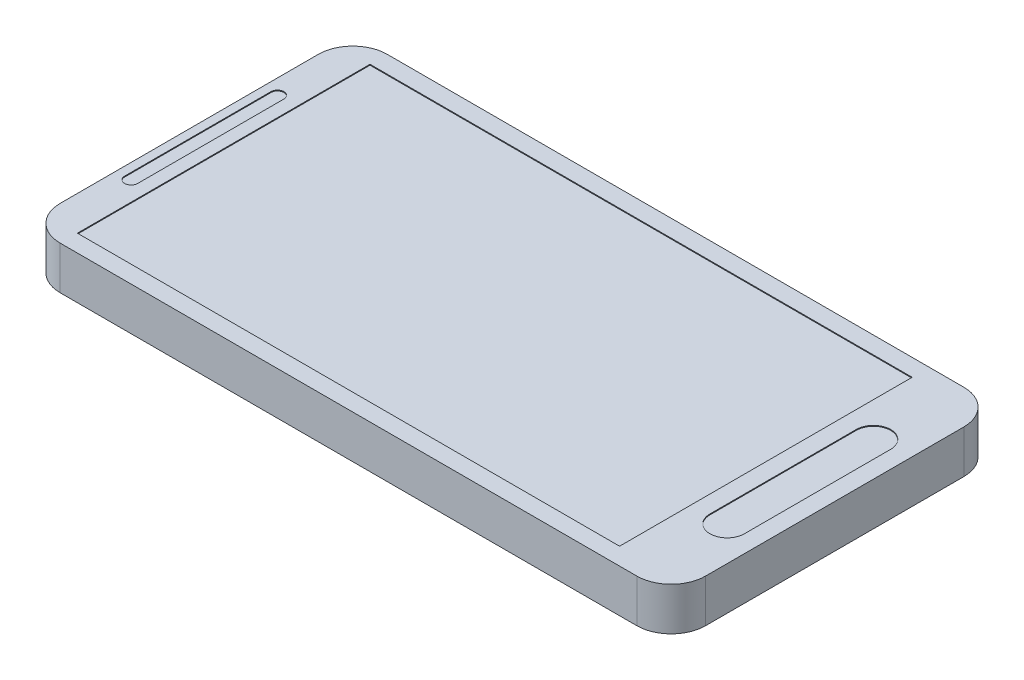
ISO-10303-21;
HEADER;
FILE_DESCRIPTION(('STEP AP214'),'2;1');
FILE_NAME('part.step','',(''),(''),'','','');
FILE_SCHEMA(('AUTOMOTIVE_DESIGN { 1 0 10303 214 1 1 1 1 }'));
ENDSEC;
DATA;
#1=APPLICATION_CONTEXT('core data for automotive mechanical design processes');
#2=APPLICATION_PROTOCOL_DEFINITION('international standard','automotive_design',2000,#1);
#3=PRODUCT_CONTEXT('',#1,'mechanical');
#4=PRODUCT('Part','Part','',(#3));
#5=PRODUCT_RELATED_PRODUCT_CATEGORY('part','',(#4));
#6=PRODUCT_DEFINITION_FORMATION('','',#4);
#7=PRODUCT_DEFINITION_CONTEXT('part definition',#1,'design');
#8=PRODUCT_DEFINITION('design','',#6,#7);
#9=PRODUCT_DEFINITION_SHAPE('','',#8);
#10=(LENGTH_UNIT() NAMED_UNIT(*) SI_UNIT(.MILLI.,.METRE.));
#11=(NAMED_UNIT(*) PLANE_ANGLE_UNIT() SI_UNIT($,.RADIAN.));
#12=(NAMED_UNIT(*) SI_UNIT($,.STERADIAN.) SOLID_ANGLE_UNIT());
#13=UNCERTAINTY_MEASURE_WITH_UNIT(LENGTH_MEASURE(1.E-05),#10,'distance_accuracy_value','');
#14=(GEOMETRIC_REPRESENTATION_CONTEXT(3) GLOBAL_UNCERTAINTY_ASSIGNED_CONTEXT((#13)) GLOBAL_UNIT_ASSIGNED_CONTEXT((#10,
#11,#12)) REPRESENTATION_CONTEXT('',''));
#15=CARTESIAN_POINT('',(0.,0.,0.));
#16=DIRECTION('',(0.,0.,1.));
#17=DIRECTION('',(1.,0.,0.));
#18=AXIS2_PLACEMENT_3D('',#15,#16,#17);
#19=CARTESIAN_POINT('',(0.,10.,0.));
#20=DIRECTION('',(1.,0.,0.));
#21=DIRECTION('',(0.,0.,-1.));
#22=AXIS2_PLACEMENT_3D('',#19,#20,#21);
#23=PLANE('',#22);
#24=DIRECTION('',(0.,0.,1.));
#25=VECTOR('',#24,1.);
#26=CARTESIAN_POINT('',(0.,0.,0.));
#27=LINE('',#26,#25);
#28=CARTESIAN_POINT('',(0.,0.,-68.));
#29=VERTEX_POINT('',#28);
#30=CARTESIAN_POINT('',(0.,0.,-8.));
#31=VERTEX_POINT('',#30);
#32=EDGE_CURVE('E271',#29,#31,#27,.T.);
#33=ORIENTED_EDGE('',*,*,#32,.T.);
#34=DIRECTION('',(0.,-1.,0.));
#35=VECTOR('',#34,1.);
#36=CARTESIAN_POINT('',(0.,10.,-8.));
#37=LINE('',#36,#35);
#38=CARTESIAN_POINT('',(0.,10.,-8.));
#39=VERTEX_POINT('',#38);
#40=EDGE_CURVE('E314',#31,#39,#37,.F.);
#41=ORIENTED_EDGE('',*,*,#40,.T.);
#42=DIRECTION('',(0.,0.,1.));
#43=VECTOR('',#42,1.);
#44=CARTESIAN_POINT('',(0.,10.,0.));
#45=LINE('',#44,#43);
#46=CARTESIAN_POINT('',(0.,10.,-68.));
#47=VERTEX_POINT('',#46);
#48=EDGE_CURVE('E278',#47,#39,#45,.T.);
#49=ORIENTED_EDGE('',*,*,#48,.F.);
#50=DIRECTION('',(0.,-1.,0.));
#51=VECTOR('',#50,1.);
#52=CARTESIAN_POINT('',(0.,10.,-68.));
#53=LINE('',#52,#51);
#54=EDGE_CURVE('E311',#47,#29,#53,.T.);
#55=ORIENTED_EDGE('',*,*,#54,.T.);
#56=EDGE_LOOP('',(#33,#41,#49,#55));
#57=FACE_BOUND('',#56,.T.);
#58=ADVANCED_FACE('F33',(#57),#23,.F.);
#59=CARTESIAN_POINT('',(0.,10.,0.));
#60=DIRECTION('',(0.,0.,-1.));
#61=DIRECTION('',(-1.,0.,0.));
#62=AXIS2_PLACEMENT_3D('',#59,#60,#61);
#63=PLANE('',#62);
#64=DIRECTION('',(1.,0.,0.));
#65=VECTOR('',#64,1.);
#66=CARTESIAN_POINT('',(0.,10.,0.));
#67=LINE('',#66,#65);
#68=CARTESIAN_POINT('',(8.,10.,0.));
#69=VERTEX_POINT('',#68);
#70=CARTESIAN_POINT('',(142.,10.,0.));
#71=VERTEX_POINT('',#70);
#72=EDGE_CURVE('E281',#69,#71,#67,.T.);
#73=ORIENTED_EDGE('',*,*,#72,.F.);
#74=DIRECTION('',(0.,-1.,0.));
#75=VECTOR('',#74,1.);
#76=CARTESIAN_POINT('',(8.,10.,0.));
#77=LINE('',#76,#75);
#78=CARTESIAN_POINT('',(8.,0.,0.));
#79=VERTEX_POINT('',#78);
#80=EDGE_CURVE('E300',#69,#79,#77,.T.);
#81=ORIENTED_EDGE('',*,*,#80,.T.);
#82=DIRECTION('',(1.,0.,0.));
#83=VECTOR('',#82,1.);
#84=CARTESIAN_POINT('',(0.,0.,0.));
#85=LINE('',#84,#83);
#86=CARTESIAN_POINT('',(142.,0.,0.));
#87=VERTEX_POINT('',#86);
#88=EDGE_CURVE('E292',#79,#87,#85,.T.);
#89=ORIENTED_EDGE('',*,*,#88,.T.);
#90=DIRECTION('',(0.,-1.,0.));
#91=VECTOR('',#90,1.);
#92=CARTESIAN_POINT('',(142.,10.,0.));
#93=LINE('',#92,#91);
#94=EDGE_CURVE('E289',#87,#71,#93,.F.);
#95=ORIENTED_EDGE('',*,*,#94,.T.);
#96=EDGE_LOOP('',(#73,#81,#89,#95));
#97=FACE_BOUND('',#96,.T.);
#98=ADVANCED_FACE('F358',(#97),#63,.F.);
#99=CARTESIAN_POINT('',(150.,10.,0.));
#100=DIRECTION('',(-1.,0.,0.));
#101=DIRECTION('',(0.,0.,1.));
#102=AXIS2_PLACEMENT_3D('',#99,#100,#101);
#103=PLANE('',#102);
#104=DIRECTION('',(0.,0.,-1.));
#105=VECTOR('',#104,1.);
#106=CARTESIAN_POINT('',(150.,0.,0.));
#107=LINE('',#106,#105);
#108=CARTESIAN_POINT('',(150.,0.,-8.));
#109=VERTEX_POINT('',#108);
#110=CARTESIAN_POINT('',(150.,0.,-68.));
#111=VERTEX_POINT('',#110);
#112=EDGE_CURVE('E295',#109,#111,#107,.T.);
#113=ORIENTED_EDGE('',*,*,#112,.T.);
#114=DIRECTION('',(0.,-1.,0.));
#115=VECTOR('',#114,1.);
#116=CARTESIAN_POINT('',(150.,10.,-68.));
#117=LINE('',#116,#115);
#118=CARTESIAN_POINT('',(150.,10.,-68.));
#119=VERTEX_POINT('',#118);
#120=EDGE_CURVE('E11',#111,#119,#117,.F.);
#121=ORIENTED_EDGE('',*,*,#120,.T.);
#122=DIRECTION('',(0.,0.,-1.));
#123=VECTOR('',#122,1.);
#124=CARTESIAN_POINT('',(150.,10.,0.));
#125=LINE('',#124,#123);
#126=CARTESIAN_POINT('',(150.,10.,-8.));
#127=VERTEX_POINT('',#126);
#128=EDGE_CURVE('E285',#127,#119,#125,.T.);
#129=ORIENTED_EDGE('',*,*,#128,.F.);
#130=DIRECTION('',(0.,-1.,0.));
#131=VECTOR('',#130,1.);
#132=CARTESIAN_POINT('',(150.,10.,-8.));
#133=LINE('',#132,#131);
#134=EDGE_CURVE('E41',#127,#109,#133,.T.);
#135=ORIENTED_EDGE('',*,*,#134,.T.);
#136=EDGE_LOOP('',(#113,#121,#129,#135));
#137=FACE_BOUND('',#136,.T.);
#138=ADVANCED_FACE('F331',(#137),#103,.F.);
#139=CARTESIAN_POINT('',(0.,10.,-76.));
#140=DIRECTION('',(0.,0.,1.));
#141=DIRECTION('',(1.,0.,0.));
#142=AXIS2_PLACEMENT_3D('',#139,#140,#141);
#143=PLANE('',#142);
#144=DIRECTION('',(-1.,0.,0.));
#145=VECTOR('',#144,1.);
#146=CARTESIAN_POINT('',(0.,0.,-76.));
#147=LINE('',#146,#145);
#148=CARTESIAN_POINT('',(142.,0.,-76.));
#149=VERTEX_POINT('',#148);
#150=CARTESIAN_POINT('',(8.,0.,-76.));
#151=VERTEX_POINT('',#150);
#152=EDGE_CURVE('E282',#149,#151,#147,.T.);
#153=ORIENTED_EDGE('',*,*,#152,.T.);
#154=DIRECTION('',(0.,-1.,0.));
#155=VECTOR('',#154,1.);
#156=CARTESIAN_POINT('',(8.,10.,-76.));
#157=LINE('',#156,#155);
#158=CARTESIAN_POINT('',(8.,10.,-76.));
#159=VERTEX_POINT('',#158);
#160=EDGE_CURVE('E48',#151,#159,#157,.F.);
#161=ORIENTED_EDGE('',*,*,#160,.T.);
#162=DIRECTION('',(-1.,0.,0.));
#163=VECTOR('',#162,1.);
#164=CARTESIAN_POINT('',(0.,10.,-76.));
#165=LINE('',#164,#163);
#166=CARTESIAN_POINT('',(142.,10.,-76.));
#167=VERTEX_POINT('',#166);
#168=EDGE_CURVE('E287',#167,#159,#165,.T.);
#169=ORIENTED_EDGE('',*,*,#168,.F.);
#170=DIRECTION('',(0.,-1.,0.));
#171=VECTOR('',#170,1.);
#172=CARTESIAN_POINT('',(142.,10.,-76.));
#173=LINE('',#172,#171);
#174=EDGE_CURVE('E323',#167,#149,#173,.T.);
#175=ORIENTED_EDGE('',*,*,#174,.T.);
#176=EDGE_LOOP('',(#153,#161,#169,#175));
#177=FACE_BOUND('',#176,.T.);
#178=ADVANCED_FACE('F342',(#177),#143,.F.);
#179=CARTESIAN_POINT('',(0.,10.,0.));
#180=DIRECTION('',(0.,-1.,0.));
#181=DIRECTION('',(0.,0.,-1.));
#182=AXIS2_PLACEMENT_3D('',#179,#180,#181);
#183=PLANE('',#182);
#184=DIRECTION('',(0.,0.,1.));
#185=VECTOR('',#184,1.);
#186=CARTESIAN_POINT('',(1.99999999999999,10.,-55.));
#187=LINE('',#186,#185);
#188=CARTESIAN_POINT('',(1.99999999999999,10.,-55.));
#189=VERTEX_POINT('',#188);
#190=CARTESIAN_POINT('',(2.,10.,-21.));
#191=VERTEX_POINT('',#190);
#192=EDGE_CURVE('E231',#189,#191,#187,.T.);
#193=ORIENTED_EDGE('',*,*,#192,.F.);
#194=CARTESIAN_POINT('',(3.49999999999999,10.,-55.));
#195=DIRECTION('',(0.,1.,0.));
#196=DIRECTION('',(0.,0.,1.));
#197=AXIS2_PLACEMENT_3D('',#194,#195,#196);
#198=CIRCLE('',#197,1.5);
#199=CARTESIAN_POINT('',(4.99999999999999,10.,-55.));
#200=VERTEX_POINT('',#199);
#201=EDGE_CURVE('E229',#200,#189,#198,.T.);
#202=ORIENTED_EDGE('',*,*,#201,.F.);
#203=DIRECTION('',(0.,0.,-1.));
#204=VECTOR('',#203,1.);
#205=CARTESIAN_POINT('',(4.99999999999999,10.,-55.));
#206=LINE('',#205,#204);
#207=CARTESIAN_POINT('',(5.,10.,-21.));
#208=VERTEX_POINT('',#207);
#209=EDGE_CURVE('E219',#208,#200,#206,.T.);
#210=ORIENTED_EDGE('',*,*,#209,.F.);
#211=CARTESIAN_POINT('',(3.5,10.,-21.));
#212=DIRECTION('',(0.,1.,0.));
#213=DIRECTION('',(0.,0.,1.));
#214=AXIS2_PLACEMENT_3D('',#211,#212,#213);
#215=CIRCLE('',#214,1.5);
#216=EDGE_CURVE('E234',#191,#208,#215,.T.);
#217=ORIENTED_EDGE('',*,*,#216,.F.);
#218=EDGE_LOOP('',(#193,#202,#210,#217));
#219=FACE_BOUND('',#218,.T.);
#220=DIRECTION('',(0.,0.,-1.));
#221=VECTOR('',#220,1.);
#222=CARTESIAN_POINT('',(146.,10.,-21.));
#223=LINE('',#222,#221);
#224=CARTESIAN_POINT('',(146.,10.,-21.));
#225=VERTEX_POINT('',#224);
#226=CARTESIAN_POINT('',(146.,10.,-55.));
#227=VERTEX_POINT('',#226);
#228=EDGE_CURVE('E204',#225,#227,#223,.T.);
#229=ORIENTED_EDGE('',*,*,#228,.F.);
#230=CARTESIAN_POINT('',(142.,10.,-21.));
#231=DIRECTION('',(0.,1.,0.));
#232=DIRECTION('',(0.,0.,1.));
#233=AXIS2_PLACEMENT_3D('',#230,#231,#232);
#234=CIRCLE('',#233,4.);
#235=CARTESIAN_POINT('',(138.,10.,-21.));
#236=VERTEX_POINT('',#235);
#237=EDGE_CURVE('E178',#236,#225,#234,.T.);
#238=ORIENTED_EDGE('',*,*,#237,.F.);
#239=DIRECTION('',(0.,0.,1.));
#240=VECTOR('',#239,1.);
#241=CARTESIAN_POINT('',(138.,10.,-21.));
#242=LINE('',#241,#240);
#243=CARTESIAN_POINT('',(138.,10.,-55.));
#244=VERTEX_POINT('',#243);
#245=EDGE_CURVE('E195',#244,#236,#242,.T.);
#246=ORIENTED_EDGE('',*,*,#245,.F.);
#247=CARTESIAN_POINT('',(142.,10.,-55.));
#248=DIRECTION('',(0.,1.,0.));
#249=DIRECTION('',(0.,0.,1.));
#250=AXIS2_PLACEMENT_3D('',#247,#248,#249);
#251=CIRCLE('',#250,4.);
#252=EDGE_CURVE('E198',#227,#244,#251,.T.);
#253=ORIENTED_EDGE('',*,*,#252,.F.);
#254=EDGE_LOOP('',(#229,#238,#246,#253));
#255=FACE_BOUND('',#254,.T.);
#256=DIRECTION('',(1.,0.,0.));
#257=VECTOR('',#256,1.);
#258=CARTESIAN_POINT('',(8.00000000000002,10.,-4.));
#259=LINE('',#258,#257);
#260=CARTESIAN_POINT('',(8.00000000000002,10.,-4.));
#261=VERTEX_POINT('',#260);
#262=CARTESIAN_POINT('',(134.,10.,-4.00000000000002));
#263=VERTEX_POINT('',#262);
#264=EDGE_CURVE('E261',#261,#263,#259,.T.);
#265=ORIENTED_EDGE('',*,*,#264,.F.);
#266=DIRECTION('',(0.,0.,1.));
#267=VECTOR('',#266,1.);
#268=CARTESIAN_POINT('',(8.,10.,-72.));
#269=LINE('',#268,#267);
#270=CARTESIAN_POINT('',(8.,10.,-72.));
#271=VERTEX_POINT('',#270);
#272=EDGE_CURVE('E211',#271,#261,#269,.T.);
#273=ORIENTED_EDGE('',*,*,#272,.F.);
#274=DIRECTION('',(-1.,0.,0.));
#275=VECTOR('',#274,1.);
#276=CARTESIAN_POINT('',(134.,10.,-72.));
#277=LINE('',#276,#275);
#278=CARTESIAN_POINT('',(134.,10.,-72.));
#279=VERTEX_POINT('',#278);
#280=EDGE_CURVE('E250',#279,#271,#277,.T.);
#281=ORIENTED_EDGE('',*,*,#280,.F.);
#282=DIRECTION('',(0.,0.,-1.));
#283=VECTOR('',#282,1.);
#284=CARTESIAN_POINT('',(134.,10.,-4.00000000000002));
#285=LINE('',#284,#283);
#286=EDGE_CURVE('E264',#263,#279,#285,.T.);
#287=ORIENTED_EDGE('',*,*,#286,.F.);
#288=EDGE_LOOP('',(#265,#273,#281,#287));
#289=FACE_BOUND('',#288,.T.);
#290=ORIENTED_EDGE('',*,*,#48,.T.);
#291=CARTESIAN_POINT('',(8.,10.,-8.));
#292=DIRECTION('',(0.,-1.,0.));
#293=DIRECTION('',(0.,0.,-1.));
#294=AXIS2_PLACEMENT_3D('',#291,#292,#293);
#295=CIRCLE('',#294,8.);
#296=EDGE_CURVE('E321',#39,#69,#295,.F.);
#297=ORIENTED_EDGE('',*,*,#296,.T.);
#298=ORIENTED_EDGE('',*,*,#72,.T.);
#299=CARTESIAN_POINT('',(142.,10.,-8.));
#300=DIRECTION('',(0.,-1.,0.));
#301=DIRECTION('',(0.,0.,-1.));
#302=AXIS2_PLACEMENT_3D('',#299,#300,#301);
#303=CIRCLE('',#302,8.);
#304=EDGE_CURVE('E316',#71,#127,#303,.F.);
#305=ORIENTED_EDGE('',*,*,#304,.T.);
#306=ORIENTED_EDGE('',*,*,#128,.T.);
#307=CARTESIAN_POINT('',(142.,10.,-68.));
#308=DIRECTION('',(0.,-1.,0.));
#309=DIRECTION('',(0.,0.,-1.));
#310=AXIS2_PLACEMENT_3D('',#307,#308,#309);
#311=CIRCLE('',#310,8.);
#312=EDGE_CURVE('E55',#119,#167,#311,.F.);
#313=ORIENTED_EDGE('',*,*,#312,.T.);
#314=ORIENTED_EDGE('',*,*,#168,.T.);
#315=CARTESIAN_POINT('',(8.,10.,-68.));
#316=DIRECTION('',(0.,-1.,0.));
#317=DIRECTION('',(0.,0.,-1.));
#318=AXIS2_PLACEMENT_3D('',#315,#316,#317);
#319=CIRCLE('',#318,8.);
#320=EDGE_CURVE('E319',#159,#47,#319,.F.);
#321=ORIENTED_EDGE('',*,*,#320,.T.);
#322=EDGE_LOOP('',(#290,#297,#298,#305,#306,#313,#314,#321));
#323=FACE_BOUND('',#322,.T.);
#324=ADVANCED_FACE('F344',(#219,#255,#289,#323),#183,.F.);
#325=CARTESIAN_POINT('',(0.,0.,0.));
#326=DIRECTION('',(0.,-1.,0.));
#327=DIRECTION('',(0.,0.,-1.));
#328=AXIS2_PLACEMENT_3D('',#325,#326,#327);
#329=PLANE('',#328);
#330=ORIENTED_EDGE('',*,*,#88,.F.);
#331=CARTESIAN_POINT('',(8.,0.,-8.));
#332=DIRECTION('',(0.,-1.,0.));
#333=DIRECTION('',(0.,0.,-1.));
#334=AXIS2_PLACEMENT_3D('',#331,#332,#333);
#335=CIRCLE('',#334,8.);
#336=EDGE_CURVE('E309',#79,#31,#335,.T.);
#337=ORIENTED_EDGE('',*,*,#336,.T.);
#338=ORIENTED_EDGE('',*,*,#32,.F.);
#339=CARTESIAN_POINT('',(8.,0.,-68.));
#340=DIRECTION('',(0.,-1.,0.));
#341=DIRECTION('',(0.,0.,-1.));
#342=AXIS2_PLACEMENT_3D('',#339,#340,#341);
#343=CIRCLE('',#342,8.);
#344=EDGE_CURVE('E307',#29,#151,#343,.T.);
#345=ORIENTED_EDGE('',*,*,#344,.T.);
#346=ORIENTED_EDGE('',*,*,#152,.F.);
#347=CARTESIAN_POINT('',(142.,0.,-68.));
#348=DIRECTION('',(0.,-1.,0.));
#349=DIRECTION('',(0.,0.,-1.));
#350=AXIS2_PLACEMENT_3D('',#347,#348,#349);
#351=CIRCLE('',#350,8.);
#352=EDGE_CURVE('E305',#149,#111,#351,.T.);
#353=ORIENTED_EDGE('',*,*,#352,.T.);
#354=ORIENTED_EDGE('',*,*,#112,.F.);
#355=CARTESIAN_POINT('',(142.,0.,-8.));
#356=DIRECTION('',(0.,-1.,0.));
#357=DIRECTION('',(0.,0.,-1.));
#358=AXIS2_PLACEMENT_3D('',#355,#356,#357);
#359=CIRCLE('',#358,8.);
#360=EDGE_CURVE('E303',#109,#87,#359,.T.);
#361=ORIENTED_EDGE('',*,*,#360,.T.);
#362=EDGE_LOOP('',(#330,#337,#338,#345,#346,#353,#354,#361));
#363=FACE_BOUND('',#362,.T.);
#364=ADVANCED_FACE('F337',(#363),#329,.T.);
#365=CARTESIAN_POINT('',(8.,9.8,-72.));
#366=DIRECTION('',(-1.,0.,0.));
#367=DIRECTION('',(0.,0.,1.));
#368=AXIS2_PLACEMENT_3D('',#365,#366,#367);
#369=PLANE('',#368);
#370=ORIENTED_EDGE('',*,*,#272,.T.);
#371=DIRECTION('',(0.,1.,0.));
#372=VECTOR('',#371,1.);
#373=CARTESIAN_POINT('',(8.00000000000002,9.8,-4.));
#374=LINE('',#373,#372);
#375=CARTESIAN_POINT('',(8.00000000000002,9.8,-4.));
#376=VERTEX_POINT('',#375);
#377=EDGE_CURVE('E259',#376,#261,#374,.T.);
#378=ORIENTED_EDGE('',*,*,#377,.F.);
#379=DIRECTION('',(0.,0.,1.));
#380=VECTOR('',#379,1.);
#381=CARTESIAN_POINT('',(8.,9.8,-72.));
#382=LINE('',#381,#380);
#383=CARTESIAN_POINT('',(8.,9.8,-72.));
#384=VERTEX_POINT('',#383);
#385=EDGE_CURVE('E246',#384,#376,#382,.T.);
#386=ORIENTED_EDGE('',*,*,#385,.F.);
#387=DIRECTION('',(0.,1.,0.));
#388=VECTOR('',#387,1.);
#389=CARTESIAN_POINT('',(8.,9.8,-72.));
#390=LINE('',#389,#388);
#391=EDGE_CURVE('E269',#384,#271,#390,.T.);
#392=ORIENTED_EDGE('',*,*,#391,.T.);
#393=EDGE_LOOP('',(#370,#378,#386,#392));
#394=FACE_BOUND('',#393,.T.);
#395=ADVANCED_FACE('F516',(#394),#369,.F.);
#396=CARTESIAN_POINT('',(134.,9.8,-72.));
#397=DIRECTION('',(0.,0.,-1.));
#398=DIRECTION('',(-1.,0.,0.));
#399=AXIS2_PLACEMENT_3D('',#396,#397,#398);
#400=PLANE('',#399);
#401=ORIENTED_EDGE('',*,*,#280,.T.);
#402=ORIENTED_EDGE('',*,*,#391,.F.);
#403=DIRECTION('',(-1.,0.,0.));
#404=VECTOR('',#403,1.);
#405=CARTESIAN_POINT('',(134.,9.8,-72.));
#406=LINE('',#405,#404);
#407=CARTESIAN_POINT('',(134.,9.8,-72.));
#408=VERTEX_POINT('',#407);
#409=EDGE_CURVE('E256',#408,#384,#406,.T.);
#410=ORIENTED_EDGE('',*,*,#409,.F.);
#411=DIRECTION('',(0.,1.,0.));
#412=VECTOR('',#411,1.);
#413=CARTESIAN_POINT('',(134.,9.8,-72.));
#414=LINE('',#413,#412);
#415=EDGE_CURVE('E272',#408,#279,#414,.T.);
#416=ORIENTED_EDGE('',*,*,#415,.T.);
#417=EDGE_LOOP('',(#401,#402,#410,#416));
#418=FACE_BOUND('',#417,.T.);
#419=ADVANCED_FACE('F507',(#418),#400,.F.);
#420=CARTESIAN_POINT('',(134.,9.8,-4.00000000000002));
#421=DIRECTION('',(1.,0.,0.));
#422=DIRECTION('',(0.,0.,-1.));
#423=AXIS2_PLACEMENT_3D('',#420,#421,#422);
#424=PLANE('',#423);
#425=ORIENTED_EDGE('',*,*,#286,.T.);
#426=ORIENTED_EDGE('',*,*,#415,.F.);
#427=DIRECTION('',(0.,0.,-1.));
#428=VECTOR('',#427,1.);
#429=CARTESIAN_POINT('',(134.,9.8,-4.00000000000002));
#430=LINE('',#429,#428);
#431=CARTESIAN_POINT('',(134.,9.8,-4.00000000000002));
#432=VERTEX_POINT('',#431);
#433=EDGE_CURVE('E253',#432,#408,#430,.T.);
#434=ORIENTED_EDGE('',*,*,#433,.F.);
#435=DIRECTION('',(0.,1.,0.));
#436=VECTOR('',#435,1.);
#437=CARTESIAN_POINT('',(134.,9.8,-4.00000000000002));
#438=LINE('',#437,#436);
#439=EDGE_CURVE('E274',#432,#263,#438,.T.);
#440=ORIENTED_EDGE('',*,*,#439,.T.);
#441=EDGE_LOOP('',(#425,#426,#434,#440));
#442=FACE_BOUND('',#441,.T.);
#443=ADVANCED_FACE('F498',(#442),#424,.F.);
#444=CARTESIAN_POINT('',(8.00000000000002,9.8,-4.));
#445=DIRECTION('',(0.,0.,1.));
#446=DIRECTION('',(1.,0.,0.));
#447=AXIS2_PLACEMENT_3D('',#444,#445,#446);
#448=PLANE('',#447);
#449=ORIENTED_EDGE('',*,*,#264,.T.);
#450=ORIENTED_EDGE('',*,*,#439,.F.);
#451=DIRECTION('',(1.,0.,0.));
#452=VECTOR('',#451,1.);
#453=CARTESIAN_POINT('',(8.00000000000002,9.8,-4.));
#454=LINE('',#453,#452);
#455=EDGE_CURVE('E249',#376,#432,#454,.T.);
#456=ORIENTED_EDGE('',*,*,#455,.F.);
#457=ORIENTED_EDGE('',*,*,#377,.T.);
#458=EDGE_LOOP('',(#449,#450,#456,#457));
#459=FACE_BOUND('',#458,.T.);
#460=ADVANCED_FACE('F489',(#459),#448,.F.);
#461=CARTESIAN_POINT('',(0.,9.8,0.));
#462=DIRECTION('',(0.,1.,0.));
#463=DIRECTION('',(0.,0.,1.));
#464=AXIS2_PLACEMENT_3D('',#461,#462,#463);
#465=PLANE('',#464);
#466=ORIENTED_EDGE('',*,*,#385,.T.);
#467=ORIENTED_EDGE('',*,*,#455,.T.);
#468=ORIENTED_EDGE('',*,*,#433,.T.);
#469=ORIENTED_EDGE('',*,*,#409,.T.);
#470=EDGE_LOOP('',(#466,#467,#468,#469));
#471=FACE_BOUND('',#470,.T.);
#472=ADVANCED_FACE('F481',(#471),#465,.T.);
#473=CARTESIAN_POINT('',(142.,9.8,-21.));
#474=DIRECTION('',(0.,1.,0.));
#475=DIRECTION('',(0.,0.,1.));
#476=AXIS2_PLACEMENT_3D('',#473,#474,#475);
#477=CYLINDRICAL_SURFACE('',#476,4.);
#478=ORIENTED_EDGE('',*,*,#237,.T.);
#479=DIRECTION('',(0.,1.,0.));
#480=VECTOR('',#479,1.);
#481=CARTESIAN_POINT('',(146.,9.8,-21.));
#482=LINE('',#481,#480);
#483=CARTESIAN_POINT('',(146.,9.8,-21.));
#484=VERTEX_POINT('',#483);
#485=EDGE_CURVE('E171',#484,#225,#482,.T.);
#486=ORIENTED_EDGE('',*,*,#485,.F.);
#487=CARTESIAN_POINT('',(142.,9.8,-21.));
#488=DIRECTION('',(0.,1.,0.));
#489=DIRECTION('',(0.,0.,1.));
#490=AXIS2_PLACEMENT_3D('',#487,#488,#489);
#491=CIRCLE('',#490,4.);
#492=CARTESIAN_POINT('',(138.,9.8,-21.));
#493=VERTEX_POINT('',#492);
#494=EDGE_CURVE('E175',#493,#484,#491,.T.);
#495=ORIENTED_EDGE('',*,*,#494,.F.);
#496=DIRECTION('',(0.,1.,0.));
#497=VECTOR('',#496,1.);
#498=CARTESIAN_POINT('',(138.,9.8,-21.));
#499=LINE('',#498,#497);
#500=EDGE_CURVE('E209',#493,#236,#499,.T.);
#501=ORIENTED_EDGE('',*,*,#500,.T.);
#502=EDGE_LOOP('',(#478,#486,#495,#501));
#503=FACE_BOUND('',#502,.T.);
#504=ADVANCED_FACE('F173',(#503),#477,.F.);
#505=CARTESIAN_POINT('',(138.,9.8,-21.));
#506=DIRECTION('',(-1.,0.,0.));
#507=DIRECTION('',(0.,0.,1.));
#508=AXIS2_PLACEMENT_3D('',#505,#506,#507);
#509=PLANE('',#508);
#510=ORIENTED_EDGE('',*,*,#245,.T.);
#511=ORIENTED_EDGE('',*,*,#500,.F.);
#512=DIRECTION('',(0.,0.,1.));
#513=VECTOR('',#512,1.);
#514=CARTESIAN_POINT('',(138.,9.8,-21.));
#515=LINE('',#514,#513);
#516=CARTESIAN_POINT('',(138.,9.8,-55.));
#517=VERTEX_POINT('',#516);
#518=EDGE_CURVE('E183',#517,#493,#515,.T.);
#519=ORIENTED_EDGE('',*,*,#518,.F.);
#520=DIRECTION('',(0.,1.,0.));
#521=VECTOR('',#520,1.);
#522=CARTESIAN_POINT('',(138.,9.8,-55.));
#523=LINE('',#522,#521);
#524=EDGE_CURVE('E212',#517,#244,#523,.T.);
#525=ORIENTED_EDGE('',*,*,#524,.T.);
#526=EDGE_LOOP('',(#510,#511,#519,#525));
#527=FACE_BOUND('',#526,.T.);
#528=ADVANCED_FACE('F464',(#527),#509,.F.);
#529=CARTESIAN_POINT('',(142.,9.8,-55.));
#530=DIRECTION('',(0.,1.,0.));
#531=DIRECTION('',(0.,0.,1.));
#532=AXIS2_PLACEMENT_3D('',#529,#530,#531);
#533=CYLINDRICAL_SURFACE('',#532,4.);
#534=ORIENTED_EDGE('',*,*,#252,.T.);
#535=ORIENTED_EDGE('',*,*,#524,.F.);
#536=CARTESIAN_POINT('',(142.,9.8,-55.));
#537=DIRECTION('',(0.,1.,0.));
#538=DIRECTION('',(0.,0.,1.));
#539=AXIS2_PLACEMENT_3D('',#536,#537,#538);
#540=CIRCLE('',#539,4.);
#541=CARTESIAN_POINT('',(146.,9.8,-55.));
#542=VERTEX_POINT('',#541);
#543=EDGE_CURVE('E191',#542,#517,#540,.T.);
#544=ORIENTED_EDGE('',*,*,#543,.F.);
#545=DIRECTION('',(0.,1.,0.));
#546=VECTOR('',#545,1.);
#547=CARTESIAN_POINT('',(146.,9.8,-55.));
#548=LINE('',#547,#546);
#549=EDGE_CURVE('E182',#542,#227,#548,.T.);
#550=ORIENTED_EDGE('',*,*,#549,.T.);
#551=EDGE_LOOP('',(#534,#535,#544,#550));
#552=FACE_BOUND('',#551,.T.);
#553=ADVANCED_FACE('F456',(#552),#533,.F.);
#554=CARTESIAN_POINT('',(146.,9.8,-21.));
#555=DIRECTION('',(1.,0.,0.));
#556=DIRECTION('',(0.,0.,-1.));
#557=AXIS2_PLACEMENT_3D('',#554,#555,#556);
#558=PLANE('',#557);
#559=ORIENTED_EDGE('',*,*,#228,.T.);
#560=ORIENTED_EDGE('',*,*,#549,.F.);
#561=DIRECTION('',(0.,0.,-1.));
#562=VECTOR('',#561,1.);
#563=CARTESIAN_POINT('',(146.,9.8,-21.));
#564=LINE('',#563,#562);
#565=EDGE_CURVE('E186',#484,#542,#564,.T.);
#566=ORIENTED_EDGE('',*,*,#565,.F.);
#567=ORIENTED_EDGE('',*,*,#485,.T.);
#568=EDGE_LOOP('',(#559,#560,#566,#567));
#569=FACE_BOUND('',#568,.T.);
#570=ADVANCED_FACE('F187',(#569),#558,.F.);
#571=CARTESIAN_POINT('',(142.,9.8,-21.));
#572=DIRECTION('',(0.,1.,0.));
#573=DIRECTION('',(0.,0.,1.));
#574=AXIS2_PLACEMENT_3D('',#571,#572,#573);
#575=PLANE('',#574);
#576=ORIENTED_EDGE('',*,*,#494,.T.);
#577=ORIENTED_EDGE('',*,*,#565,.T.);
#578=ORIENTED_EDGE('',*,*,#543,.T.);
#579=ORIENTED_EDGE('',*,*,#518,.T.);
#580=EDGE_LOOP('',(#576,#577,#578,#579));
#581=FACE_BOUND('',#580,.T.);
#582=ADVANCED_FACE('F193',(#581),#575,.T.);
#583=CARTESIAN_POINT('',(3.49999999999999,9.8,-55.));
#584=DIRECTION('',(0.,1.,0.));
#585=DIRECTION('',(0.,0.,1.));
#586=AXIS2_PLACEMENT_3D('',#583,#584,#585);
#587=CYLINDRICAL_SURFACE('',#586,1.5);
#588=ORIENTED_EDGE('',*,*,#201,.T.);
#589=DIRECTION('',(0.,1.,0.));
#590=VECTOR('',#589,1.);
#591=CARTESIAN_POINT('',(1.99999999999999,9.8,-55.));
#592=LINE('',#591,#590);
#593=CARTESIAN_POINT('',(1.99999999999999,9.8,-55.));
#594=VERTEX_POINT('',#593);
#595=EDGE_CURVE('E228',#594,#189,#592,.T.);
#596=ORIENTED_EDGE('',*,*,#595,.F.);
#597=CARTESIAN_POINT('',(3.49999999999999,9.8,-55.));
#598=DIRECTION('',(0.,1.,0.));
#599=DIRECTION('',(0.,0.,1.));
#600=AXIS2_PLACEMENT_3D('',#597,#598,#599);
#601=CIRCLE('',#600,1.5);
#602=CARTESIAN_POINT('',(4.99999999999999,9.8,-55.));
#603=VERTEX_POINT('',#602);
#604=EDGE_CURVE('E215',#603,#594,#601,.T.);
#605=ORIENTED_EDGE('',*,*,#604,.F.);
#606=DIRECTION('',(0.,1.,0.));
#607=VECTOR('',#606,1.);
#608=CARTESIAN_POINT('',(4.99999999999999,9.8,-55.));
#609=LINE('',#608,#607);
#610=EDGE_CURVE('E205',#603,#200,#609,.T.);
#611=ORIENTED_EDGE('',*,*,#610,.T.);
#612=EDGE_LOOP('',(#588,#596,#605,#611));
#613=FACE_BOUND('',#612,.T.);
#614=ADVANCED_FACE('F432',(#613),#587,.F.);
#615=CARTESIAN_POINT('',(4.99999999999999,9.8,-55.));
#616=DIRECTION('',(1.,0.,0.));
#617=DIRECTION('',(0.,0.,-1.));
#618=AXIS2_PLACEMENT_3D('',#615,#616,#617);
#619=PLANE('',#618);
#620=ORIENTED_EDGE('',*,*,#209,.T.);
#621=ORIENTED_EDGE('',*,*,#610,.F.);
#622=DIRECTION('',(0.,0.,-1.));
#623=VECTOR('',#622,1.);
#624=CARTESIAN_POINT('',(4.99999999999999,9.8,-55.));
#625=LINE('',#624,#623);
#626=CARTESIAN_POINT('',(5.,9.8,-21.));
#627=VERTEX_POINT('',#626);
#628=EDGE_CURVE('E225',#627,#603,#625,.T.);
#629=ORIENTED_EDGE('',*,*,#628,.F.);
#630=DIRECTION('',(0.,1.,0.));
#631=VECTOR('',#630,1.);
#632=CARTESIAN_POINT('',(5.,9.8,-21.));
#633=LINE('',#632,#631);
#634=EDGE_CURVE('E240',#627,#208,#633,.T.);
#635=ORIENTED_EDGE('',*,*,#634,.T.);
#636=EDGE_LOOP('',(#620,#621,#629,#635));
#637=FACE_BOUND('',#636,.T.);
#638=ADVANCED_FACE('F423',(#637),#619,.F.);
#639=CARTESIAN_POINT('',(3.5,9.8,-21.));
#640=DIRECTION('',(0.,1.,0.));
#641=DIRECTION('',(0.,0.,1.));
#642=AXIS2_PLACEMENT_3D('',#639,#640,#641);
#643=CYLINDRICAL_SURFACE('',#642,1.5);
#644=ORIENTED_EDGE('',*,*,#216,.T.);
#645=ORIENTED_EDGE('',*,*,#634,.F.);
#646=CARTESIAN_POINT('',(3.5,9.8,-21.));
#647=DIRECTION('',(0.,1.,0.));
#648=DIRECTION('',(0.,0.,1.));
#649=AXIS2_PLACEMENT_3D('',#646,#647,#648);
#650=CIRCLE('',#649,1.5);
#651=CARTESIAN_POINT('',(2.,9.8,-21.));
#652=VERTEX_POINT('',#651);
#653=EDGE_CURVE('E222',#652,#627,#650,.T.);
#654=ORIENTED_EDGE('',*,*,#653,.F.);
#655=DIRECTION('',(0.,1.,0.));
#656=VECTOR('',#655,1.);
#657=CARTESIAN_POINT('',(2.,9.8,-21.));
#658=LINE('',#657,#656);
#659=EDGE_CURVE('E242',#652,#191,#658,.T.);
#660=ORIENTED_EDGE('',*,*,#659,.T.);
#661=EDGE_LOOP('',(#644,#645,#654,#660));
#662=FACE_BOUND('',#661,.T.);
#663=ADVANCED_FACE('F414',(#662),#643,.F.);
#664=CARTESIAN_POINT('',(1.99999999999999,9.8,-55.));
#665=DIRECTION('',(-1.,0.,0.));
#666=DIRECTION('',(0.,0.,1.));
#667=AXIS2_PLACEMENT_3D('',#664,#665,#666);
#668=PLANE('',#667);
#669=ORIENTED_EDGE('',*,*,#192,.T.);
#670=ORIENTED_EDGE('',*,*,#659,.F.);
#671=DIRECTION('',(0.,0.,1.));
#672=VECTOR('',#671,1.);
#673=CARTESIAN_POINT('',(1.99999999999999,9.8,-55.));
#674=LINE('',#673,#672);
#675=EDGE_CURVE('E218',#594,#652,#674,.T.);
#676=ORIENTED_EDGE('',*,*,#675,.F.);
#677=ORIENTED_EDGE('',*,*,#595,.T.);
#678=EDGE_LOOP('',(#669,#670,#676,#677));
#679=FACE_BOUND('',#678,.T.);
#680=ADVANCED_FACE('F405',(#679),#668,.F.);
#681=CARTESIAN_POINT('',(3.49999999999999,9.8,-55.));
#682=DIRECTION('',(0.,1.,0.));
#683=DIRECTION('',(0.,0.,1.));
#684=AXIS2_PLACEMENT_3D('',#681,#682,#683);
#685=PLANE('',#684);
#686=ORIENTED_EDGE('',*,*,#604,.T.);
#687=ORIENTED_EDGE('',*,*,#675,.T.);
#688=ORIENTED_EDGE('',*,*,#653,.T.);
#689=ORIENTED_EDGE('',*,*,#628,.T.);
#690=EDGE_LOOP('',(#686,#687,#688,#689));
#691=FACE_BOUND('',#690,.T.);
#692=ADVANCED_FACE('F374',(#691),#685,.T.);
#693=CARTESIAN_POINT('',(8.,10.,-8.));
#694=DIRECTION('',(0.,-1.,0.));
#695=DIRECTION('',(0.,0.,-1.));
#696=AXIS2_PLACEMENT_3D('',#693,#694,#695);
#697=CYLINDRICAL_SURFACE('',#696,8.);
#698=ORIENTED_EDGE('',*,*,#296,.F.);
#699=ORIENTED_EDGE('',*,*,#40,.F.);
#700=ORIENTED_EDGE('',*,*,#336,.F.);
#701=ORIENTED_EDGE('',*,*,#80,.F.);
#702=EDGE_LOOP('',(#698,#699,#700,#701));
#703=FACE_BOUND('',#702,.T.);
#704=ADVANCED_FACE('F355',(#703),#697,.T.);
#705=CARTESIAN_POINT('',(8.,10.,-68.));
#706=DIRECTION('',(0.,-1.,0.));
#707=DIRECTION('',(0.,0.,-1.));
#708=AXIS2_PLACEMENT_3D('',#705,#706,#707);
#709=CYLINDRICAL_SURFACE('',#708,8.);
#710=ORIENTED_EDGE('',*,*,#320,.F.);
#711=ORIENTED_EDGE('',*,*,#160,.F.);
#712=ORIENTED_EDGE('',*,*,#344,.F.);
#713=ORIENTED_EDGE('',*,*,#54,.F.);
#714=EDGE_LOOP('',(#710,#711,#712,#713));
#715=FACE_BOUND('',#714,.T.);
#716=ADVANCED_FACE('F348',(#715),#709,.T.);
#717=CARTESIAN_POINT('',(142.,10.,-68.));
#718=DIRECTION('',(0.,-1.,0.));
#719=DIRECTION('',(0.,0.,-1.));
#720=AXIS2_PLACEMENT_3D('',#717,#718,#719);
#721=CYLINDRICAL_SURFACE('',#720,8.);
#722=ORIENTED_EDGE('',*,*,#312,.F.);
#723=ORIENTED_EDGE('',*,*,#120,.F.);
#724=ORIENTED_EDGE('',*,*,#352,.F.);
#725=ORIENTED_EDGE('',*,*,#174,.F.);
#726=EDGE_LOOP('',(#722,#723,#724,#725));
#727=FACE_BOUND('',#726,.T.);
#728=ADVANCED_FACE('F341',(#727),#721,.T.);
#729=CARTESIAN_POINT('',(142.,10.,-8.));
#730=DIRECTION('',(0.,-1.,0.));
#731=DIRECTION('',(0.,0.,-1.));
#732=AXIS2_PLACEMENT_3D('',#729,#730,#731);
#733=CYLINDRICAL_SURFACE('',#732,8.);
#734=ORIENTED_EDGE('',*,*,#304,.F.);
#735=ORIENTED_EDGE('',*,*,#94,.F.);
#736=ORIENTED_EDGE('',*,*,#360,.F.);
#737=ORIENTED_EDGE('',*,*,#134,.F.);
#738=EDGE_LOOP('',(#734,#735,#736,#737));
#739=FACE_BOUND('',#738,.T.);
#740=ADVANCED_FACE('F35',(#739),#733,.T.);
#741=CLOSED_SHELL('',(#58,#98,#138,#178,#324,#364,#395,#419,#443,#460,#472,#504,#528,#553,#570,
#582,#614,#638,#663,#680,#692,#704,#716,#728,#740));
#742=MANIFOLD_SOLID_BREP('B2',#741);
#743=ADVANCED_BREP_SHAPE_REPRESENTATION('',(#18,#742),#14);
#744=SHAPE_DEFINITION_REPRESENTATION(#9,#743);
ENDSEC;
END-ISO-10303-21;
